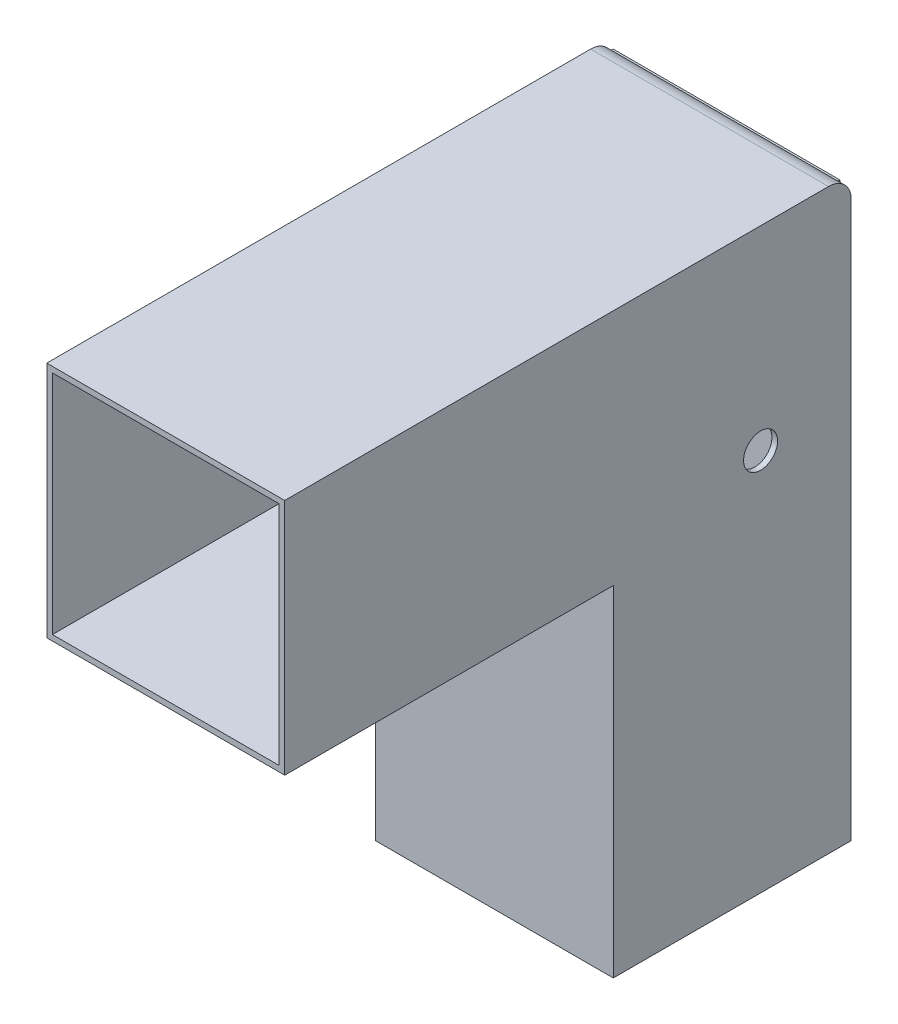
ISO-10303-21;
HEADER;
FILE_DESCRIPTION(('STEP AP214'),'2;1');
FILE_NAME('part.step','',(''),(''),'','','');
FILE_SCHEMA(('AUTOMOTIVE_DESIGN { 1 0 10303 214 1 1 1 1 }'));
ENDSEC;
DATA;
#1=APPLICATION_CONTEXT('core data for automotive mechanical design processes');
#2=APPLICATION_PROTOCOL_DEFINITION('international standard','automotive_design',2000,#1);
#3=PRODUCT_CONTEXT('',#1,'mechanical');
#4=PRODUCT('Part','Part','',(#3));
#5=PRODUCT_RELATED_PRODUCT_CATEGORY('part','',(#4));
#6=PRODUCT_DEFINITION_FORMATION('','',#4);
#7=PRODUCT_DEFINITION_CONTEXT('part definition',#1,'design');
#8=PRODUCT_DEFINITION('design','',#6,#7);
#9=PRODUCT_DEFINITION_SHAPE('','',#8);
#10=(LENGTH_UNIT() NAMED_UNIT(*) SI_UNIT(.MILLI.,.METRE.));
#11=(NAMED_UNIT(*) PLANE_ANGLE_UNIT() SI_UNIT($,.RADIAN.));
#12=(NAMED_UNIT(*) SI_UNIT($,.STERADIAN.) SOLID_ANGLE_UNIT());
#13=UNCERTAINTY_MEASURE_WITH_UNIT(LENGTH_MEASURE(1.E-05),#10,'distance_accuracy_value','');
#14=(GEOMETRIC_REPRESENTATION_CONTEXT(3) GLOBAL_UNCERTAINTY_ASSIGNED_CONTEXT((#13)) GLOBAL_UNIT_ASSIGNED_CONTEXT((#10,
#11,#12)) REPRESENTATION_CONTEXT('',''));
#15=CARTESIAN_POINT('',(0.,0.,0.));
#16=DIRECTION('',(0.,0.,1.));
#17=DIRECTION('',(1.,0.,0.));
#18=AXIS2_PLACEMENT_3D('',#15,#16,#17);
#19=CARTESIAN_POINT('',(-10.5,-10.5,50.));
#20=DIRECTION('',(0.,1.,0.));
#21=DIRECTION('',(0.,0.,1.));
#22=AXIS2_PLACEMENT_3D('',#19,#20,#21);
#23=PLANE('',#22);
#24=DIRECTION('',(-1.,0.,0.));
#25=VECTOR('',#24,1.);
#26=CARTESIAN_POINT('',(-10.5,-10.5,21.));
#27=LINE('',#26,#25);
#28=CARTESIAN_POINT('',(10.5,-10.5,21.));
#29=VERTEX_POINT('',#28);
#30=CARTESIAN_POINT('',(-10.5,-10.5,21.));
#31=VERTEX_POINT('',#30);
#32=EDGE_CURVE('E191',#29,#31,#27,.T.);
#33=ORIENTED_EDGE('',*,*,#32,.F.);
#34=DIRECTION('',(0.,0.,-1.));
#35=VECTOR('',#34,1.);
#36=CARTESIAN_POINT('',(10.5,-10.5,50.));
#37=LINE('',#36,#35);
#38=CARTESIAN_POINT('',(10.5,-10.5,50.));
#39=VERTEX_POINT('',#38);
#40=EDGE_CURVE('E217',#39,#29,#37,.T.);
#41=ORIENTED_EDGE('',*,*,#40,.F.);
#42=DIRECTION('',(1.,0.,0.));
#43=VECTOR('',#42,1.);
#44=CARTESIAN_POINT('',(-10.5,-10.5,50.));
#45=LINE('',#44,#43);
#46=CARTESIAN_POINT('',(-10.5,-10.5,50.));
#47=VERTEX_POINT('',#46);
#48=EDGE_CURVE('E215',#47,#39,#45,.T.);
#49=ORIENTED_EDGE('',*,*,#48,.F.);
#50=DIRECTION('',(0.,0.,-1.));
#51=VECTOR('',#50,1.);
#52=CARTESIAN_POINT('',(-10.5,-10.5,50.));
#53=LINE('',#52,#51);
#54=EDGE_CURVE('E222',#47,#31,#53,.T.);
#55=ORIENTED_EDGE('',*,*,#54,.T.);
#56=EDGE_LOOP('',(#33,#41,#49,#55));
#57=FACE_BOUND('',#56,.T.);
#58=ADVANCED_FACE('F37',(#57),#23,.F.);
#59=CARTESIAN_POINT('',(10.5,10.5,50.));
#60=DIRECTION('',(-1.,0.,0.));
#61=DIRECTION('',(0.,-1.,0.));
#62=AXIS2_PLACEMENT_3D('',#59,#60,#61);
#63=PLANE('',#62);
#64=CARTESIAN_POINT('',(10.5,-6.69077759280823,8.));
#65=DIRECTION('',(-1.,0.,0.));
#66=DIRECTION('',(0.,-1.,0.));
#67=AXIS2_PLACEMENT_3D('',#64,#65,#66);
#68=CIRCLE('',#67,1.5);
#69=CARTESIAN_POINT('',(10.5,-8.19077759280823,8.));
#70=VERTEX_POINT('',#69);
#71=EDGE_CURVE('E392',#70,#70,#68,.T.);
#72=ORIENTED_EDGE('',*,*,#71,.T.);
#73=EDGE_LOOP('',(#72));
#74=FACE_BOUND('',#73,.T.);
#75=DIRECTION('',(0.,1.,0.));
#76=VECTOR('',#75,1.);
#77=CARTESIAN_POINT('',(10.5,10.5,0.));
#78=LINE('',#77,#76);
#79=CARTESIAN_POINT('',(10.5,-40.5,0.));
#80=VERTEX_POINT('',#79);
#81=CARTESIAN_POINT('',(10.5,8.5,0.));
#82=VERTEX_POINT('',#81);
#83=EDGE_CURVE('E206',#80,#82,#78,.T.);
#84=ORIENTED_EDGE('',*,*,#83,.T.);
#85=CARTESIAN_POINT('',(10.5,8.5,2.));
#86=DIRECTION('',(-1.,0.,0.));
#87=DIRECTION('',(0.,-1.,0.));
#88=AXIS2_PLACEMENT_3D('',#85,#86,#87);
#89=CIRCLE('',#88,2.);
#90=CARTESIAN_POINT('',(10.5,10.5,2.));
#91=VERTEX_POINT('',#90);
#92=EDGE_CURVE('E11',#82,#91,#89,.F.);
#93=ORIENTED_EDGE('',*,*,#92,.T.);
#94=DIRECTION('',(0.,0.,-1.));
#95=VECTOR('',#94,1.);
#96=CARTESIAN_POINT('',(10.5,10.5,50.));
#97=LINE('',#96,#95);
#98=CARTESIAN_POINT('',(10.5,10.5,50.));
#99=VERTEX_POINT('',#98);
#100=EDGE_CURVE('E226',#99,#91,#97,.T.);
#101=ORIENTED_EDGE('',*,*,#100,.F.);
#102=DIRECTION('',(0.,1.,0.));
#103=VECTOR('',#102,1.);
#104=CARTESIAN_POINT('',(10.5,10.5,50.));
#105=LINE('',#104,#103);
#106=EDGE_CURVE('E207',#39,#99,#105,.T.);
#107=ORIENTED_EDGE('',*,*,#106,.F.);
#108=ORIENTED_EDGE('',*,*,#40,.T.);
#109=DIRECTION('',(0.,1.,0.));
#110=VECTOR('',#109,1.);
#111=CARTESIAN_POINT('',(10.5,-40.5,21.));
#112=LINE('',#111,#110);
#113=CARTESIAN_POINT('',(10.5,-40.5,21.));
#114=VERTEX_POINT('',#113);
#115=EDGE_CURVE('E203',#114,#29,#112,.T.);
#116=ORIENTED_EDGE('',*,*,#115,.F.);
#117=DIRECTION('',(0.,0.,1.));
#118=VECTOR('',#117,1.);
#119=CARTESIAN_POINT('',(10.5,-40.5,0.));
#120=LINE('',#119,#118);
#121=EDGE_CURVE('E194',#80,#114,#120,.T.);
#122=ORIENTED_EDGE('',*,*,#121,.F.);
#123=EDGE_LOOP('',(#84,#93,#101,#107,#108,#116,#122));
#124=FACE_BOUND('',#123,.T.);
#125=ADVANCED_FACE('F249',(#74,#124),#63,.F.);
#126=CARTESIAN_POINT('',(-10.5,10.5,50.));
#127=DIRECTION('',(0.,-1.,0.));
#128=DIRECTION('',(0.,0.,-1.));
#129=AXIS2_PLACEMENT_3D('',#126,#127,#128);
#130=PLANE('',#129);
#131=ORIENTED_EDGE('',*,*,#100,.T.);
#132=DIRECTION('',(-1.,0.,0.));
#133=VECTOR('',#132,1.);
#134=CARTESIAN_POINT('',(-10.5,10.5,2.));
#135=LINE('',#134,#133);
#136=CARTESIAN_POINT('',(-10.5,10.5,2.));
#137=VERTEX_POINT('',#136);
#138=EDGE_CURVE('E229',#91,#137,#135,.T.);
#139=ORIENTED_EDGE('',*,*,#138,.T.);
#140=DIRECTION('',(0.,0.,-1.));
#141=VECTOR('',#140,1.);
#142=CARTESIAN_POINT('',(-10.5,10.5,50.));
#143=LINE('',#142,#141);
#144=CARTESIAN_POINT('',(-10.5,10.5,50.));
#145=VERTEX_POINT('',#144);
#146=EDGE_CURVE('E224',#145,#137,#143,.T.);
#147=ORIENTED_EDGE('',*,*,#146,.F.);
#148=DIRECTION('',(-1.,0.,0.));
#149=VECTOR('',#148,1.);
#150=CARTESIAN_POINT('',(-10.5,10.5,50.));
#151=LINE('',#150,#149);
#152=EDGE_CURVE('E210',#99,#145,#151,.T.);
#153=ORIENTED_EDGE('',*,*,#152,.F.);
#154=EDGE_LOOP('',(#131,#139,#147,#153));
#155=FACE_BOUND('',#154,.T.);
#156=ADVANCED_FACE('F236',(#155),#130,.F.);
#157=CARTESIAN_POINT('',(-10.5,10.5,50.));
#158=DIRECTION('',(1.,0.,0.));
#159=DIRECTION('',(0.,1.,0.));
#160=AXIS2_PLACEMENT_3D('',#157,#158,#159);
#161=PLANE('',#160);
#162=CARTESIAN_POINT('',(-10.5,-6.69077759280824,8.));
#163=DIRECTION('',(-1.,0.,0.));
#164=DIRECTION('',(0.,-1.,0.));
#165=AXIS2_PLACEMENT_3D('',#162,#163,#164);
#166=CIRCLE('',#165,1.5);
#167=CARTESIAN_POINT('',(-10.5,-8.19077759280823,8.));
#168=VERTEX_POINT('',#167);
#169=EDGE_CURVE('E393',#168,#168,#166,.T.);
#170=ORIENTED_EDGE('',*,*,#169,.F.);
#171=EDGE_LOOP('',(#170));
#172=FACE_BOUND('',#171,.T.);
#173=ORIENTED_EDGE('',*,*,#146,.T.);
#174=CARTESIAN_POINT('',(-10.5,8.5,2.));
#175=DIRECTION('',(1.,0.,0.));
#176=DIRECTION('',(0.,1.,0.));
#177=AXIS2_PLACEMENT_3D('',#174,#175,#176);
#178=CIRCLE('',#177,2.);
#179=CARTESIAN_POINT('',(-10.5,8.5,0.));
#180=VERTEX_POINT('',#179);
#181=EDGE_CURVE('E60',#137,#180,#178,.F.);
#182=ORIENTED_EDGE('',*,*,#181,.T.);
#183=DIRECTION('',(0.,-1.,0.));
#184=VECTOR('',#183,1.);
#185=CARTESIAN_POINT('',(-10.5,10.5,0.));
#186=LINE('',#185,#184);
#187=CARTESIAN_POINT('',(-10.5,-40.5,0.));
#188=VERTEX_POINT('',#187);
#189=EDGE_CURVE('E211',#180,#188,#186,.T.);
#190=ORIENTED_EDGE('',*,*,#189,.T.);
#191=DIRECTION('',(0.,0.,-1.));
#192=VECTOR('',#191,1.);
#193=CARTESIAN_POINT('',(-10.5,-40.5,21.));
#194=LINE('',#193,#192);
#195=CARTESIAN_POINT('',(-10.5,-40.5,21.));
#196=VERTEX_POINT('',#195);
#197=EDGE_CURVE('E187',#196,#188,#194,.T.);
#198=ORIENTED_EDGE('',*,*,#197,.F.);
#199=DIRECTION('',(0.,1.,0.));
#200=VECTOR('',#199,1.);
#201=CARTESIAN_POINT('',(-10.5,-40.5,21.));
#202=LINE('',#201,#200);
#203=EDGE_CURVE('E198',#196,#31,#202,.T.);
#204=ORIENTED_EDGE('',*,*,#203,.T.);
#205=ORIENTED_EDGE('',*,*,#54,.F.);
#206=DIRECTION('',(0.,-1.,0.));
#207=VECTOR('',#206,1.);
#208=CARTESIAN_POINT('',(-10.5,10.5,50.));
#209=LINE('',#208,#207);
#210=EDGE_CURVE('E213',#145,#47,#209,.T.);
#211=ORIENTED_EDGE('',*,*,#210,.F.);
#212=EDGE_LOOP('',(#173,#182,#190,#198,#204,#205,#211));
#213=FACE_BOUND('',#212,.T.);
#214=ADVANCED_FACE('F241',(#172,#213),#161,.F.);
#215=CARTESIAN_POINT('',(0.,0.,50.));
#216=DIRECTION('',(0.,0.,1.));
#217=DIRECTION('',(1.,0.,0.));
#218=AXIS2_PLACEMENT_3D('',#215,#216,#217);
#219=PLANE('',#218);
#220=DIRECTION('',(0.,1.,0.));
#221=VECTOR('',#220,1.);
#222=CARTESIAN_POINT('',(10.,10.5,50.));
#223=LINE('',#222,#221);
#224=CARTESIAN_POINT('',(10.,-10.,50.));
#225=VERTEX_POINT('',#224);
#226=CARTESIAN_POINT('',(10.,10.,50.));
#227=VERTEX_POINT('',#226);
#228=EDGE_CURVE('E171',#225,#227,#223,.T.);
#229=ORIENTED_EDGE('',*,*,#228,.F.);
#230=DIRECTION('',(1.,0.,0.));
#231=VECTOR('',#230,1.);
#232=CARTESIAN_POINT('',(-10.5,-10.,50.));
#233=LINE('',#232,#231);
#234=CARTESIAN_POINT('',(-10.,-10.,50.));
#235=VERTEX_POINT('',#234);
#236=EDGE_CURVE('E147',#235,#225,#233,.T.);
#237=ORIENTED_EDGE('',*,*,#236,.F.);
#238=DIRECTION('',(0.,-1.,0.));
#239=VECTOR('',#238,1.);
#240=CARTESIAN_POINT('',(-10.,10.5,50.));
#241=LINE('',#240,#239);
#242=CARTESIAN_POINT('',(-10.,10.,50.));
#243=VERTEX_POINT('',#242);
#244=EDGE_CURVE('E174',#243,#235,#241,.T.);
#245=ORIENTED_EDGE('',*,*,#244,.F.);
#246=DIRECTION('',(-1.,0.,0.));
#247=VECTOR('',#246,1.);
#248=CARTESIAN_POINT('',(-10.5,10.,50.));
#249=LINE('',#248,#247);
#250=EDGE_CURVE('E176',#227,#243,#249,.T.);
#251=ORIENTED_EDGE('',*,*,#250,.F.);
#252=EDGE_LOOP('',(#229,#237,#245,#251));
#253=FACE_BOUND('',#252,.T.);
#254=ORIENTED_EDGE('',*,*,#106,.T.);
#255=ORIENTED_EDGE('',*,*,#152,.T.);
#256=ORIENTED_EDGE('',*,*,#210,.T.);
#257=ORIENTED_EDGE('',*,*,#48,.T.);
#258=EDGE_LOOP('',(#254,#255,#256,#257));
#259=FACE_BOUND('',#258,.T.);
#260=ADVANCED_FACE('F245',(#253,#259),#219,.T.);
#261=CARTESIAN_POINT('',(0.,0.,0.));
#262=DIRECTION('',(0.,0.,1.));
#263=DIRECTION('',(1.,0.,0.));
#264=AXIS2_PLACEMENT_3D('',#261,#262,#263);
#265=PLANE('',#264);
#266=ORIENTED_EDGE('',*,*,#189,.F.);
#267=DIRECTION('',(-1.,0.,0.));
#268=VECTOR('',#267,1.);
#269=CARTESIAN_POINT('',(0.,8.5,0.));
#270=LINE('',#269,#268);
#271=EDGE_CURVE('E46',#180,#82,#270,.F.);
#272=ORIENTED_EDGE('',*,*,#271,.T.);
#273=ORIENTED_EDGE('',*,*,#83,.F.);
#274=DIRECTION('',(1.,0.,0.));
#275=VECTOR('',#274,1.);
#276=CARTESIAN_POINT('',(-10.5,-40.5,0.));
#277=LINE('',#276,#275);
#278=EDGE_CURVE('E190',#188,#80,#277,.T.);
#279=ORIENTED_EDGE('',*,*,#278,.F.);
#280=EDGE_LOOP('',(#266,#272,#273,#279));
#281=FACE_BOUND('',#280,.T.);
#282=ADVANCED_FACE('F272',(#281),#265,.F.);
#283=CARTESIAN_POINT('',(-10.5,-40.5,21.));
#284=DIRECTION('',(0.,0.,-1.));
#285=DIRECTION('',(-1.,0.,0.));
#286=AXIS2_PLACEMENT_3D('',#283,#284,#285);
#287=PLANE('',#286);
#288=ORIENTED_EDGE('',*,*,#32,.T.);
#289=ORIENTED_EDGE('',*,*,#203,.F.);
#290=DIRECTION('',(-1.,0.,0.));
#291=VECTOR('',#290,1.);
#292=CARTESIAN_POINT('',(-10.5,-40.5,21.));
#293=LINE('',#292,#291);
#294=EDGE_CURVE('E196',#114,#196,#293,.T.);
#295=ORIENTED_EDGE('',*,*,#294,.F.);
#296=ORIENTED_EDGE('',*,*,#115,.T.);
#297=EDGE_LOOP('',(#288,#289,#295,#296));
#298=FACE_BOUND('',#297,.T.);
#299=ADVANCED_FACE('F306',(#298),#287,.F.);
#300=CARTESIAN_POINT('',(0.,-40.5,0.));
#301=DIRECTION('',(0.,-1.,0.));
#302=DIRECTION('',(0.,0.,-1.));
#303=AXIS2_PLACEMENT_3D('',#300,#301,#302);
#304=PLANE('',#303);
#305=DIRECTION('',(0.,0.,-1.));
#306=VECTOR('',#305,1.);
#307=CARTESIAN_POINT('',(-9.99999999999999,-40.5,50.));
#308=LINE('',#307,#306);
#309=CARTESIAN_POINT('',(-9.99999999999999,-40.5,20.5));
#310=VERTEX_POINT('',#309);
#311=CARTESIAN_POINT('',(-9.99999999999999,-40.5,0.5));
#312=VERTEX_POINT('',#311);
#313=EDGE_CURVE('E140',#310,#312,#308,.T.);
#314=ORIENTED_EDGE('',*,*,#313,.F.);
#315=DIRECTION('',(-1.,0.,0.));
#316=VECTOR('',#315,1.);
#317=CARTESIAN_POINT('',(-10.5,-40.5,20.5));
#318=LINE('',#317,#316);
#319=CARTESIAN_POINT('',(10.,-40.5,20.5));
#320=VERTEX_POINT('',#319);
#321=EDGE_CURVE('E161',#320,#310,#318,.T.);
#322=ORIENTED_EDGE('',*,*,#321,.F.);
#323=DIRECTION('',(0.,0.,1.));
#324=VECTOR('',#323,1.);
#325=CARTESIAN_POINT('',(10.,-40.5,50.));
#326=LINE('',#325,#324);
#327=CARTESIAN_POINT('',(10.,-40.5,0.5));
#328=VERTEX_POINT('',#327);
#329=EDGE_CURVE('E154',#328,#320,#326,.T.);
#330=ORIENTED_EDGE('',*,*,#329,.F.);
#331=DIRECTION('',(1.,0.,0.));
#332=VECTOR('',#331,1.);
#333=CARTESIAN_POINT('',(0.,-40.5,0.5));
#334=LINE('',#333,#332);
#335=EDGE_CURVE('E181',#312,#328,#334,.T.);
#336=ORIENTED_EDGE('',*,*,#335,.F.);
#337=EDGE_LOOP('',(#314,#322,#330,#336));
#338=FACE_BOUND('',#337,.T.);
#339=ORIENTED_EDGE('',*,*,#197,.T.);
#340=ORIENTED_EDGE('',*,*,#278,.T.);
#341=ORIENTED_EDGE('',*,*,#121,.T.);
#342=ORIENTED_EDGE('',*,*,#294,.T.);
#343=EDGE_LOOP('',(#339,#340,#341,#342));
#344=FACE_BOUND('',#343,.T.);
#345=ADVANCED_FACE('F310',(#338,#344),#304,.T.);
#346=CARTESIAN_POINT('',(-10.5,-10.,50.));
#347=DIRECTION('',(0.,1.,0.));
#348=DIRECTION('',(0.,0.,1.));
#349=AXIS2_PLACEMENT_3D('',#346,#347,#348);
#350=PLANE('',#349);
#351=DIRECTION('',(-1.,0.,0.));
#352=VECTOR('',#351,1.);
#353=CARTESIAN_POINT('',(-10.5,-10.,20.5));
#354=LINE('',#353,#352);
#355=CARTESIAN_POINT('',(10.,-10.,20.5));
#356=VERTEX_POINT('',#355);
#357=CARTESIAN_POINT('',(-10.,-10.,20.5));
#358=VERTEX_POINT('',#357);
#359=EDGE_CURVE('E131',#356,#358,#354,.T.);
#360=ORIENTED_EDGE('',*,*,#359,.T.);
#361=DIRECTION('',(0.,0.,-1.));
#362=VECTOR('',#361,1.);
#363=CARTESIAN_POINT('',(-10.,-10.,50.));
#364=LINE('',#363,#362);
#365=EDGE_CURVE('E150',#235,#358,#364,.T.);
#366=ORIENTED_EDGE('',*,*,#365,.F.);
#367=ORIENTED_EDGE('',*,*,#236,.T.);
#368=DIRECTION('',(0.,0.,-1.));
#369=VECTOR('',#368,1.);
#370=CARTESIAN_POINT('',(10.,-10.,50.));
#371=LINE('',#370,#369);
#372=EDGE_CURVE('E144',#225,#356,#371,.T.);
#373=ORIENTED_EDGE('',*,*,#372,.T.);
#374=EDGE_LOOP('',(#360,#366,#367,#373));
#375=FACE_BOUND('',#374,.T.);
#376=ADVANCED_FACE('F145',(#375),#350,.T.);
#377=CARTESIAN_POINT('',(10.,10.5,50.));
#378=DIRECTION('',(-1.,0.,0.));
#379=DIRECTION('',(0.,-1.,0.));
#380=AXIS2_PLACEMENT_3D('',#377,#378,#379);
#381=PLANE('',#380);
#382=CARTESIAN_POINT('',(10.,-6.69077759280823,8.));
#383=DIRECTION('',(-1.,0.,0.));
#384=DIRECTION('',(0.,-1.,0.));
#385=AXIS2_PLACEMENT_3D('',#382,#383,#384);
#386=CIRCLE('',#385,1.5);
#387=CARTESIAN_POINT('',(10.,-8.19077759280823,8.));
#388=VERTEX_POINT('',#387);
#389=EDGE_CURVE('E141',#388,#388,#386,.T.);
#390=ORIENTED_EDGE('',*,*,#389,.F.);
#391=EDGE_LOOP('',(#390));
#392=FACE_BOUND('',#391,.T.);
#393=DIRECTION('',(0.,1.,0.));
#394=VECTOR('',#393,1.);
#395=CARTESIAN_POINT('',(10.,10.5,0.5));
#396=LINE('',#395,#394);
#397=CARTESIAN_POINT('',(10.,10.,0.5));
#398=VERTEX_POINT('',#397);
#399=EDGE_CURVE('E156',#328,#398,#396,.T.);
#400=ORIENTED_EDGE('',*,*,#399,.F.);
#401=ORIENTED_EDGE('',*,*,#329,.T.);
#402=DIRECTION('',(0.,1.,0.));
#403=VECTOR('',#402,1.);
#404=CARTESIAN_POINT('',(10.,-40.5,20.5));
#405=LINE('',#404,#403);
#406=EDGE_CURVE('E135',#320,#356,#405,.T.);
#407=ORIENTED_EDGE('',*,*,#406,.T.);
#408=ORIENTED_EDGE('',*,*,#372,.F.);
#409=ORIENTED_EDGE('',*,*,#228,.T.);
#410=DIRECTION('',(0.,0.,-1.));
#411=VECTOR('',#410,1.);
#412=CARTESIAN_POINT('',(9.99999999999999,10.,50.));
#413=LINE('',#412,#411);
#414=EDGE_CURVE('E165',#227,#398,#413,.T.);
#415=ORIENTED_EDGE('',*,*,#414,.T.);
#416=EDGE_LOOP('',(#400,#401,#407,#408,#409,#415));
#417=FACE_BOUND('',#416,.T.);
#418=ADVANCED_FACE('F152',(#392,#417),#381,.T.);
#419=CARTESIAN_POINT('',(-10.5,10.,50.));
#420=DIRECTION('',(0.,-1.,0.));
#421=DIRECTION('',(0.,0.,-1.));
#422=AXIS2_PLACEMENT_3D('',#419,#420,#421);
#423=PLANE('',#422);
#424=DIRECTION('',(-1.,0.,0.));
#425=VECTOR('',#424,1.);
#426=CARTESIAN_POINT('',(-10.5,10.,0.5));
#427=LINE('',#426,#425);
#428=CARTESIAN_POINT('',(-10.,10.,0.5));
#429=VERTEX_POINT('',#428);
#430=EDGE_CURVE('E159',#398,#429,#427,.T.);
#431=ORIENTED_EDGE('',*,*,#430,.F.);
#432=ORIENTED_EDGE('',*,*,#414,.F.);
#433=ORIENTED_EDGE('',*,*,#250,.T.);
#434=DIRECTION('',(0.,0.,-1.));
#435=VECTOR('',#434,1.);
#436=CARTESIAN_POINT('',(-10.,10.,50.));
#437=LINE('',#436,#435);
#438=EDGE_CURVE('E168',#243,#429,#437,.T.);
#439=ORIENTED_EDGE('',*,*,#438,.T.);
#440=EDGE_LOOP('',(#431,#432,#433,#439));
#441=FACE_BOUND('',#440,.T.);
#442=ADVANCED_FACE('F331',(#441),#423,.T.);
#443=CARTESIAN_POINT('',(-10.,10.5,50.));
#444=DIRECTION('',(1.,0.,0.));
#445=DIRECTION('',(0.,1.,0.));
#446=AXIS2_PLACEMENT_3D('',#443,#444,#445);
#447=PLANE('',#446);
#448=CARTESIAN_POINT('',(-10.,-6.69077759280824,8.));
#449=DIRECTION('',(1.,0.,0.));
#450=DIRECTION('',(0.,1.,0.));
#451=AXIS2_PLACEMENT_3D('',#448,#449,#450);
#452=CIRCLE('',#451,1.5);
#453=CARTESIAN_POINT('',(-10.,-5.19077759280824,8.));
#454=VERTEX_POINT('',#453);
#455=EDGE_CURVE('E41',#454,#454,#452,.T.);
#456=ORIENTED_EDGE('',*,*,#455,.F.);
#457=EDGE_LOOP('',(#456));
#458=FACE_BOUND('',#457,.T.);
#459=DIRECTION('',(0.,-1.,0.));
#460=VECTOR('',#459,1.);
#461=CARTESIAN_POINT('',(-10.,10.5,0.5));
#462=LINE('',#461,#460);
#463=EDGE_CURVE('E167',#429,#312,#462,.T.);
#464=ORIENTED_EDGE('',*,*,#463,.F.);
#465=ORIENTED_EDGE('',*,*,#438,.F.);
#466=ORIENTED_EDGE('',*,*,#244,.T.);
#467=ORIENTED_EDGE('',*,*,#365,.T.);
#468=DIRECTION('',(0.,1.,0.));
#469=VECTOR('',#468,1.);
#470=CARTESIAN_POINT('',(-10.,10.5,20.5));
#471=LINE('',#470,#469);
#472=EDGE_CURVE('E138',#310,#358,#471,.T.);
#473=ORIENTED_EDGE('',*,*,#472,.F.);
#474=ORIENTED_EDGE('',*,*,#313,.T.);
#475=EDGE_LOOP('',(#464,#465,#466,#467,#473,#474));
#476=FACE_BOUND('',#475,.T.);
#477=ADVANCED_FACE('F342',(#458,#476),#447,.T.);
#478=CARTESIAN_POINT('',(0.,0.,0.5));
#479=DIRECTION('',(0.,0.,1.));
#480=DIRECTION('',(1.,0.,0.));
#481=AXIS2_PLACEMENT_3D('',#478,#479,#480);
#482=PLANE('',#481);
#483=ORIENTED_EDGE('',*,*,#399,.T.);
#484=ORIENTED_EDGE('',*,*,#430,.T.);
#485=ORIENTED_EDGE('',*,*,#463,.T.);
#486=ORIENTED_EDGE('',*,*,#335,.T.);
#487=EDGE_LOOP('',(#483,#484,#485,#486));
#488=FACE_BOUND('',#487,.T.);
#489=ADVANCED_FACE('F260',(#488),#482,.T.);
#490=CARTESIAN_POINT('',(-10.5,-40.5,20.5));
#491=DIRECTION('',(0.,0.,-1.));
#492=DIRECTION('',(-1.,0.,0.));
#493=AXIS2_PLACEMENT_3D('',#490,#491,#492);
#494=PLANE('',#493);
#495=ORIENTED_EDGE('',*,*,#359,.F.);
#496=ORIENTED_EDGE('',*,*,#406,.F.);
#497=ORIENTED_EDGE('',*,*,#321,.T.);
#498=ORIENTED_EDGE('',*,*,#472,.T.);
#499=EDGE_LOOP('',(#495,#496,#497,#498));
#500=FACE_BOUND('',#499,.T.);
#501=ADVANCED_FACE('F133',(#500),#494,.T.);
#502=CARTESIAN_POINT('',(-10.5,8.5,2.));
#503=DIRECTION('',(-1.,0.,0.));
#504=DIRECTION('',(0.,0.,1.));
#505=AXIS2_PLACEMENT_3D('',#502,#503,#504);
#506=CYLINDRICAL_SURFACE('',#505,2.);
#507=ORIENTED_EDGE('',*,*,#92,.F.);
#508=ORIENTED_EDGE('',*,*,#271,.F.);
#509=ORIENTED_EDGE('',*,*,#181,.F.);
#510=ORIENTED_EDGE('',*,*,#138,.F.);
#511=EDGE_LOOP('',(#507,#508,#509,#510));
#512=FACE_BOUND('',#511,.T.);
#513=ADVANCED_FACE('F39',(#512),#506,.T.);
#514=CARTESIAN_POINT('',(10.5,-6.69077759280823,8.));
#515=DIRECTION('',(-1.,0.,0.));
#516=DIRECTION('',(0.,-1.,0.));
#517=AXIS2_PLACEMENT_3D('',#514,#515,#516);
#518=CYLINDRICAL_SURFACE('',#517,1.5);
#519=ORIENTED_EDGE('',*,*,#455,.T.);
#520=EDGE_LOOP('',(#519));
#521=FACE_BOUND('',#520,.T.);
#522=ORIENTED_EDGE('',*,*,#169,.T.);
#523=EDGE_LOOP('',(#522));
#524=FACE_BOUND('',#523,.T.);
#525=ADVANCED_FACE('F252',(#521,#524),#518,.F.);
#526=ORIENTED_EDGE('',*,*,#389,.T.);
#527=EDGE_LOOP('',(#526));
#528=FACE_BOUND('',#527,.T.);
#529=ORIENTED_EDGE('',*,*,#71,.F.);
#530=EDGE_LOOP('',(#529));
#531=FACE_BOUND('',#530,.T.);
#532=ADVANCED_FACE('F257',(#528,#531),#518,.F.);
#533=CLOSED_SHELL('',(#58,#125,#156,#214,#260,#282,#299,#345,#376,#418,#442,#477,#489,#501,#513,
#525,#532));
#534=MANIFOLD_SOLID_BREP('B2',#533);
#535=ADVANCED_BREP_SHAPE_REPRESENTATION('',(#18,#534),#14);
#536=SHAPE_DEFINITION_REPRESENTATION(#9,#535);
ENDSEC;
END-ISO-10303-21;
